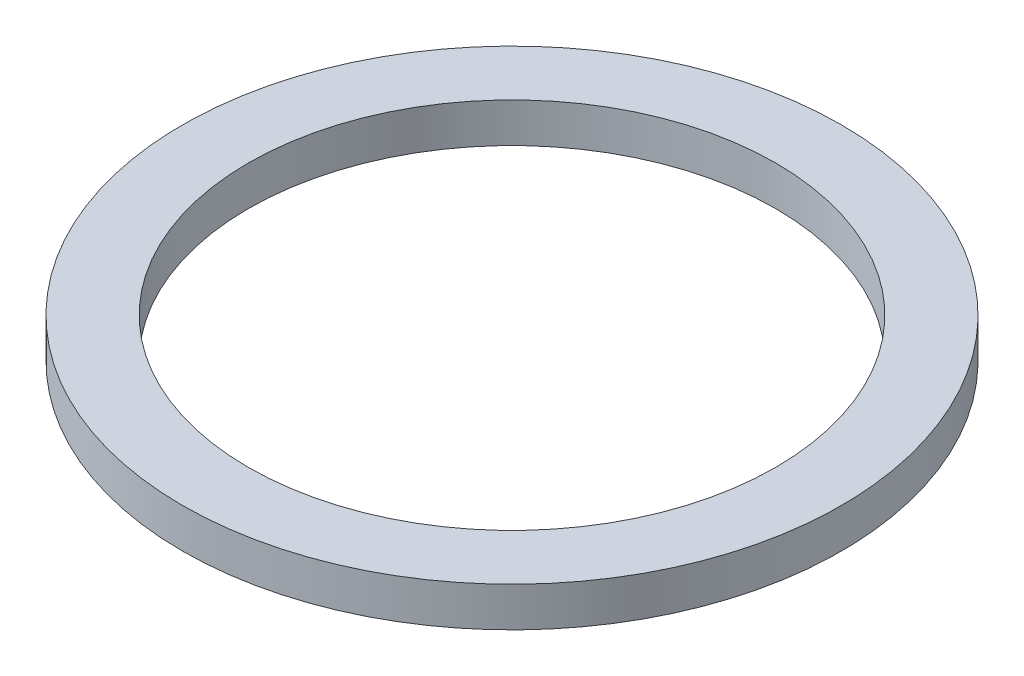
ISO-10303-21;
HEADER;
FILE_DESCRIPTION(('STEP AP214'),'2;1');
FILE_NAME('part.step','',(''),(''),'','','');
FILE_SCHEMA(('AUTOMOTIVE_DESIGN { 1 0 10303 214 1 1 1 1 }'));
ENDSEC;
DATA;
#1=APPLICATION_CONTEXT('core data for automotive mechanical design processes');
#2=APPLICATION_PROTOCOL_DEFINITION('international standard','automotive_design',2000,#1);
#3=PRODUCT_CONTEXT('',#1,'mechanical');
#4=PRODUCT('Part','Part','',(#3));
#5=PRODUCT_RELATED_PRODUCT_CATEGORY('part','',(#4));
#6=PRODUCT_DEFINITION_FORMATION('','',#4);
#7=PRODUCT_DEFINITION_CONTEXT('part definition',#1,'design');
#8=PRODUCT_DEFINITION('design','',#6,#7);
#9=PRODUCT_DEFINITION_SHAPE('','',#8);
#10=(LENGTH_UNIT() NAMED_UNIT(*) SI_UNIT(.MILLI.,.METRE.));
#11=(NAMED_UNIT(*) PLANE_ANGLE_UNIT() SI_UNIT($,.RADIAN.));
#12=(NAMED_UNIT(*) SI_UNIT($,.STERADIAN.) SOLID_ANGLE_UNIT());
#13=UNCERTAINTY_MEASURE_WITH_UNIT(LENGTH_MEASURE(1.E-05),#10,'distance_accuracy_value','');
#14=(GEOMETRIC_REPRESENTATION_CONTEXT(3) GLOBAL_UNCERTAINTY_ASSIGNED_CONTEXT((#13)) GLOBAL_UNIT_ASSIGNED_CONTEXT((#10,
#11,#12)) REPRESENTATION_CONTEXT('',''));
#15=CARTESIAN_POINT('',(0.,0.,0.));
#16=DIRECTION('',(0.,0.,1.));
#17=DIRECTION('',(1.,0.,0.));
#18=AXIS2_PLACEMENT_3D('',#15,#16,#17);
#19=CARTESIAN_POINT('',(0.,3.,0.));
#20=DIRECTION('',(0.,1.,0.));
#21=DIRECTION('',(0.,0.,1.));
#22=AXIS2_PLACEMENT_3D('',#19,#20,#21);
#23=PLANE('',#22);
#24=CARTESIAN_POINT('',(0.,3.,0.));
#25=DIRECTION('',(0.,1.,0.));
#26=DIRECTION('',(0.,0.,1.));
#27=AXIS2_PLACEMENT_3D('',#24,#25,#26);
#28=CIRCLE('',#27,25.);
#29=CARTESIAN_POINT('',(0.,3.,25.));
#30=VERTEX_POINT('',#29);
#31=EDGE_CURVE('E10',#30,#30,#28,.T.);
#32=ORIENTED_EDGE('',*,*,#31,.T.);
#33=EDGE_LOOP('',(#32));
#34=FACE_BOUND('',#33,.T.);
#35=CARTESIAN_POINT('',(0.,3.,0.));
#36=DIRECTION('',(0.,1.,0.));
#37=DIRECTION('',(0.,0.,1.));
#38=AXIS2_PLACEMENT_3D('',#35,#36,#37);
#39=CIRCLE('',#38,20.);
#40=CARTESIAN_POINT('',(0.,3.,20.));
#41=VERTEX_POINT('',#40);
#42=EDGE_CURVE('E50',#41,#41,#39,.T.);
#43=ORIENTED_EDGE('',*,*,#42,.F.);
#44=EDGE_LOOP('',(#43));
#45=FACE_BOUND('',#44,.T.);
#46=ADVANCED_FACE('F37',(#34,#45),#23,.T.);
#47=CARTESIAN_POINT('',(0.,0.,0.));
#48=DIRECTION('',(0.,1.,0.));
#49=DIRECTION('',(0.,0.,1.));
#50=AXIS2_PLACEMENT_3D('',#47,#48,#49);
#51=PLANE('',#50);
#52=CARTESIAN_POINT('',(0.,0.,0.));
#53=DIRECTION('',(0.,1.,0.));
#54=DIRECTION('',(0.,0.,1.));
#55=AXIS2_PLACEMENT_3D('',#52,#53,#54);
#56=CIRCLE('',#55,25.);
#57=CARTESIAN_POINT('',(0.,0.,25.));
#58=VERTEX_POINT('',#57);
#59=EDGE_CURVE('E41',#58,#58,#56,.T.);
#60=ORIENTED_EDGE('',*,*,#59,.F.);
#61=EDGE_LOOP('',(#60));
#62=FACE_BOUND('',#61,.T.);
#63=CARTESIAN_POINT('',(0.,0.,0.));
#64=DIRECTION('',(0.,1.,0.));
#65=DIRECTION('',(0.,0.,1.));
#66=AXIS2_PLACEMENT_3D('',#63,#64,#65);
#67=CIRCLE('',#66,20.);
#68=CARTESIAN_POINT('',(0.,0.,20.));
#69=VERTEX_POINT('',#68);
#70=EDGE_CURVE('E52',#69,#69,#67,.T.);
#71=ORIENTED_EDGE('',*,*,#70,.T.);
#72=EDGE_LOOP('',(#71));
#73=FACE_BOUND('',#72,.T.);
#74=ADVANCED_FACE('F64',(#62,#73),#51,.F.);
#75=CARTESIAN_POINT('',(0.,3.,0.));
#76=DIRECTION('',(0.,-1.,0.));
#77=DIRECTION('',(0.,0.,-1.));
#78=AXIS2_PLACEMENT_3D('',#75,#76,#77);
#79=CYLINDRICAL_SURFACE('',#78,25.);
#80=ORIENTED_EDGE('',*,*,#31,.F.);
#81=EDGE_LOOP('',(#80));
#82=FACE_BOUND('',#81,.T.);
#83=ORIENTED_EDGE('',*,*,#59,.T.);
#84=EDGE_LOOP('',(#83));
#85=FACE_BOUND('',#84,.T.);
#86=ADVANCED_FACE('F39',(#82,#85),#79,.T.);
#87=CARTESIAN_POINT('',(0.,3.,0.));
#88=DIRECTION('',(0.,-1.,0.));
#89=DIRECTION('',(0.,0.,-1.));
#90=AXIS2_PLACEMENT_3D('',#87,#88,#89);
#91=CYLINDRICAL_SURFACE('',#90,20.);
#92=ORIENTED_EDGE('',*,*,#42,.T.);
#93=EDGE_LOOP('',(#92));
#94=FACE_BOUND('',#93,.T.);
#95=ORIENTED_EDGE('',*,*,#70,.F.);
#96=EDGE_LOOP('',(#95));
#97=FACE_BOUND('',#96,.T.);
#98=ADVANCED_FACE('F60',(#94,#97),#91,.F.);
#99=CLOSED_SHELL('',(#46,#74,#86,#98));
#100=MANIFOLD_SOLID_BREP('B2',#99);
#101=ADVANCED_BREP_SHAPE_REPRESENTATION('',(#18,#100),#14);
#102=SHAPE_DEFINITION_REPRESENTATION(#9,#101);
ENDSEC;
END-ISO-10303-21;
